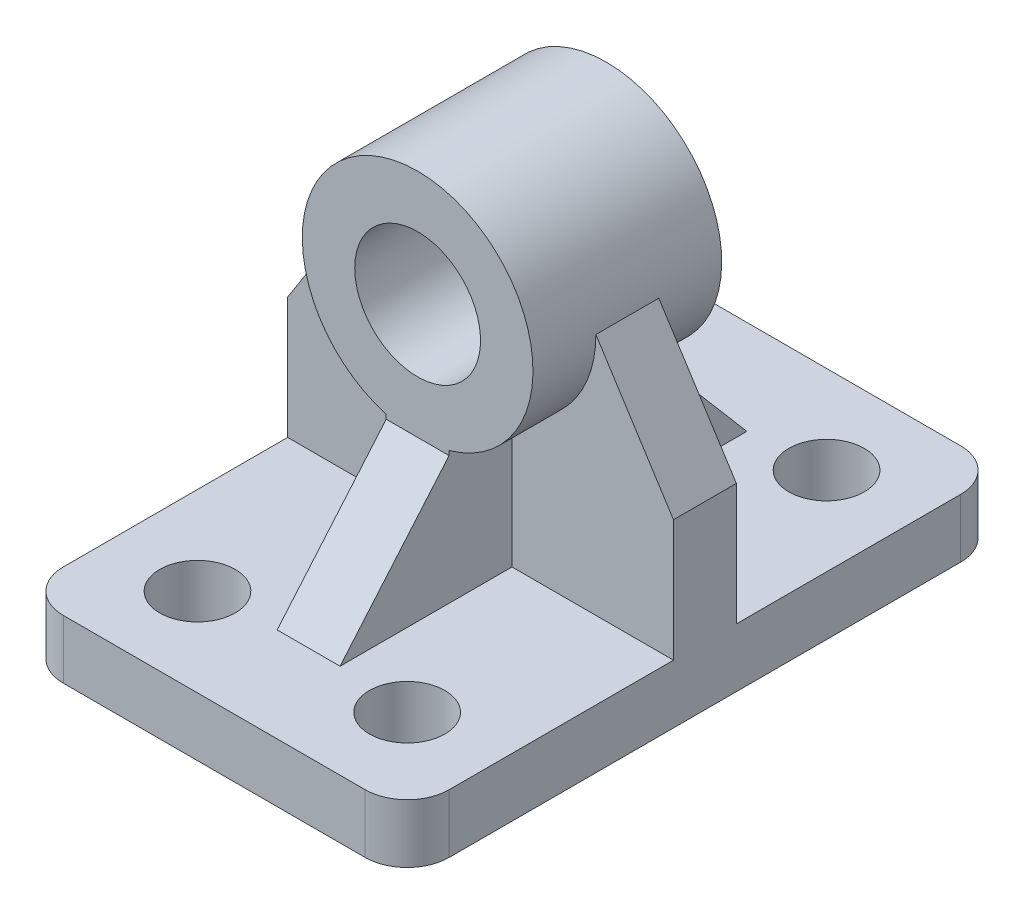
ISO-10303-21;
HEADER;
FILE_DESCRIPTION(('STEP AP214'),'2;1');
FILE_NAME('part.step','',(''),(''),'','','');
FILE_SCHEMA(('AUTOMOTIVE_DESIGN { 1 0 10303 214 1 1 1 1 }'));
ENDSEC;
DATA;
#1=APPLICATION_CONTEXT('core data for automotive mechanical design processes');
#2=APPLICATION_PROTOCOL_DEFINITION('international standard','automotive_design',2000,#1);
#3=PRODUCT_CONTEXT('',#1,'mechanical');
#4=PRODUCT('Part','Part','',(#3));
#5=PRODUCT_RELATED_PRODUCT_CATEGORY('part','',(#4));
#6=PRODUCT_DEFINITION_FORMATION('','',#4);
#7=PRODUCT_DEFINITION_CONTEXT('part definition',#1,'design');
#8=PRODUCT_DEFINITION('design','',#6,#7);
#9=PRODUCT_DEFINITION_SHAPE('','',#8);
#10=(LENGTH_UNIT() NAMED_UNIT(*) SI_UNIT(.MILLI.,.METRE.));
#11=(NAMED_UNIT(*) PLANE_ANGLE_UNIT() SI_UNIT($,.RADIAN.));
#12=(NAMED_UNIT(*) SI_UNIT($,.STERADIAN.) SOLID_ANGLE_UNIT());
#13=UNCERTAINTY_MEASURE_WITH_UNIT(LENGTH_MEASURE(1.E-05),#10,'distance_accuracy_value','');
#14=(GEOMETRIC_REPRESENTATION_CONTEXT(3) GLOBAL_UNCERTAINTY_ASSIGNED_CONTEXT((#13)) GLOBAL_UNIT_ASSIGNED_CONTEXT((#10,
#11,#12)) REPRESENTATION_CONTEXT('',''));
#15=CARTESIAN_POINT('',(0.,0.,0.));
#16=DIRECTION('',(0.,0.,1.));
#17=DIRECTION('',(1.,0.,0.));
#18=AXIS2_PLACEMENT_3D('',#15,#16,#17);
#19=CARTESIAN_POINT('',(0.,72.,-7.5));
#20=DIRECTION('',(0.,0.,1.));
#21=DIRECTION('',(1.,0.,0.));
#22=AXIS2_PLACEMENT_3D('',#19,#20,#21);
#23=PLANE('',#22);
#24=DIRECTION('',(0.,1.,0.));
#25=VECTOR('',#24,1.);
#26=CARTESIAN_POINT('',(-7.5,72.,-7.5));
#27=LINE('',#26,#25);
#28=CARTESIAN_POINT('',(-7.5,14.,-7.5));
#29=VERTEX_POINT('',#28);
#30=CARTESIAN_POINT('',(-7.5,45.5424868893541,-7.5));
#31=VERTEX_POINT('',#30);
#32=EDGE_CURVE('E227',#29,#31,#27,.T.);
#33=ORIENTED_EDGE('',*,*,#32,.F.);
#34=DIRECTION('',(1.,0.,0.));
#35=VECTOR('',#34,1.);
#36=CARTESIAN_POINT('',(-46.,14.,-7.5));
#37=LINE('',#36,#35);
#38=CARTESIAN_POINT('',(-46.,14.,-7.49999999999999));
#39=VERTEX_POINT('',#38);
#40=EDGE_CURVE('E296',#39,#29,#37,.T.);
#41=ORIENTED_EDGE('',*,*,#40,.F.);
#42=DIRECTION('',(0.,-1.,0.));
#43=VECTOR('',#42,1.);
#44=CARTESIAN_POINT('',(-46.,14.,-7.5));
#45=LINE('',#44,#43);
#46=CARTESIAN_POINT('',(-46.,43.,-7.5));
#47=VERTEX_POINT('',#46);
#48=EDGE_CURVE('E308',#47,#39,#45,.T.);
#49=ORIENTED_EDGE('',*,*,#48,.F.);
#50=DIRECTION('',(-0.537815694759539,-0.843062440433871,0.));
#51=VECTOR('',#50,1.);
#52=CARTESIAN_POINT('',(-46.,43.,-7.5));
#53=LINE('',#52,#51);
#54=CARTESIAN_POINT('',(-27.5,72.,-7.5));
#55=VERTEX_POINT('',#54);
#56=EDGE_CURVE('E306',#55,#47,#53,.T.);
#57=ORIENTED_EDGE('',*,*,#56,.F.);
#58=CARTESIAN_POINT('',(0.,72.,-7.5));
#59=DIRECTION('',(0.,0.,-1.));
#60=DIRECTION('',(1.,0.,0.));
#61=AXIS2_PLACEMENT_3D('',#58,#59,#60);
#62=CIRCLE('',#61,27.5);
#63=EDGE_CURVE('E302',#31,#55,#62,.T.);
#64=ORIENTED_EDGE('',*,*,#63,.F.);
#65=EDGE_LOOP('',(#33,#41,#49,#57,#64));
#66=FACE_BOUND('',#65,.T.);
#67=ADVANCED_FACE('F37',(#66),#23,.F.);
#68=CARTESIAN_POINT('',(0.,72.,7.5));
#69=DIRECTION('',(0.,0.,1.));
#70=DIRECTION('',(1.,0.,0.));
#71=AXIS2_PLACEMENT_3D('',#68,#69,#70);
#72=PLANE('',#71);
#73=DIRECTION('',(1.,0.,0.));
#74=VECTOR('',#73,1.);
#75=CARTESIAN_POINT('',(-46.,14.,7.5));
#76=LINE('',#75,#74);
#77=CARTESIAN_POINT('',(-46.,14.,7.49999999999999));
#78=VERTEX_POINT('',#77);
#79=CARTESIAN_POINT('',(-7.5,14.,7.5));
#80=VERTEX_POINT('',#79);
#81=EDGE_CURVE('E278',#78,#80,#76,.T.);
#82=ORIENTED_EDGE('',*,*,#81,.T.);
#83=DIRECTION('',(0.,1.,0.));
#84=VECTOR('',#83,1.);
#85=CARTESIAN_POINT('',(-7.5,72.,7.5));
#86=LINE('',#85,#84);
#87=CARTESIAN_POINT('',(-7.5,45.5424868893541,7.5));
#88=VERTEX_POINT('',#87);
#89=EDGE_CURVE('E253',#80,#88,#86,.T.);
#90=ORIENTED_EDGE('',*,*,#89,.T.);
#91=CARTESIAN_POINT('',(0.,72.,7.5));
#92=DIRECTION('',(0.,0.,-1.));
#93=DIRECTION('',(1.,0.,0.));
#94=AXIS2_PLACEMENT_3D('',#91,#92,#93);
#95=CIRCLE('',#94,27.5);
#96=CARTESIAN_POINT('',(-27.5,72.,7.5));
#97=VERTEX_POINT('',#96);
#98=EDGE_CURVE('E286',#88,#97,#95,.T.);
#99=ORIENTED_EDGE('',*,*,#98,.T.);
#100=DIRECTION('',(-0.537815694759539,-0.843062440433871,0.));
#101=VECTOR('',#100,1.);
#102=CARTESIAN_POINT('',(-46.,43.,7.5));
#103=LINE('',#102,#101);
#104=CARTESIAN_POINT('',(-46.,43.,7.5));
#105=VERTEX_POINT('',#104);
#106=EDGE_CURVE('E290',#97,#105,#103,.T.);
#107=ORIENTED_EDGE('',*,*,#106,.T.);
#108=DIRECTION('',(0.,-1.,0.));
#109=VECTOR('',#108,1.);
#110=CARTESIAN_POINT('',(-46.,14.,7.5));
#111=LINE('',#110,#109);
#112=EDGE_CURVE('E292',#105,#78,#111,.T.);
#113=ORIENTED_EDGE('',*,*,#112,.T.);
#114=EDGE_LOOP('',(#82,#90,#99,#107,#113));
#115=FACE_BOUND('',#114,.T.);
#116=ADVANCED_FACE('F450',(#115),#72,.T.);
#117=CARTESIAN_POINT('',(0.,14.,0.));
#118=DIRECTION('',(0.,-1.,0.));
#119=DIRECTION('',(0.,0.,-1.));
#120=AXIS2_PLACEMENT_3D('',#117,#118,#119);
#121=PLANE('',#120);
#122=CARTESIAN_POINT('',(25.,14.,50.));
#123=DIRECTION('',(0.,1.,0.));
#124=DIRECTION('',(0.,0.,1.));
#125=AXIS2_PLACEMENT_3D('',#122,#123,#124);
#126=CIRCLE('',#125,9.);
#127=CARTESIAN_POINT('',(25.,14.,59.));
#128=VERTEX_POINT('',#127);
#129=EDGE_CURVE('E341',#128,#128,#126,.T.);
#130=ORIENTED_EDGE('',*,*,#129,.F.);
#131=EDGE_LOOP('',(#130));
#132=FACE_BOUND('',#131,.T.);
#133=DIRECTION('',(0.,0.,1.));
#134=VECTOR('',#133,1.);
#135=CARTESIAN_POINT('',(7.5,14.,0.));
#136=LINE('',#135,#134);
#137=CARTESIAN_POINT('',(7.5,14.,7.5));
#138=VERTEX_POINT('',#137);
#139=CARTESIAN_POINT('',(7.5,14.,48.5));
#140=VERTEX_POINT('',#139);
#141=EDGE_CURVE('E264',#138,#140,#136,.T.);
#142=ORIENTED_EDGE('',*,*,#141,.T.);
#143=DIRECTION('',(1.,0.,0.));
#144=VECTOR('',#143,1.);
#145=CARTESIAN_POINT('',(0.,14.,48.5));
#146=LINE('',#145,#144);
#147=CARTESIAN_POINT('',(-7.5,14.,48.5));
#148=VERTEX_POINT('',#147);
#149=EDGE_CURVE('E266',#140,#148,#146,.F.);
#150=ORIENTED_EDGE('',*,*,#149,.T.);
#151=DIRECTION('',(0.,0.,1.));
#152=VECTOR('',#151,1.);
#153=CARTESIAN_POINT('',(-7.5,14.,0.));
#154=LINE('',#153,#152);
#155=EDGE_CURVE('E256',#80,#148,#154,.T.);
#156=ORIENTED_EDGE('',*,*,#155,.F.);
#157=ORIENTED_EDGE('',*,*,#81,.F.);
#158=DIRECTION('',(0.,0.,1.));
#159=VECTOR('',#158,1.);
#160=CARTESIAN_POINT('',(-46.,14.,71.));
#161=LINE('',#160,#159);
#162=CARTESIAN_POINT('',(-46.,14.,61.));
#163=VERTEX_POINT('',#162);
#164=EDGE_CURVE('E353',#78,#163,#161,.T.);
#165=ORIENTED_EDGE('',*,*,#164,.T.);
#166=CARTESIAN_POINT('',(-36.,14.,61.));
#167=DIRECTION('',(0.,-1.,0.));
#168=DIRECTION('',(0.,0.,-1.));
#169=AXIS2_PLACEMENT_3D('',#166,#167,#168);
#170=CIRCLE('',#169,10.);
#171=CARTESIAN_POINT('',(-36.,14.,71.));
#172=VERTEX_POINT('',#171);
#173=EDGE_CURVE('E389',#163,#172,#170,.F.);
#174=ORIENTED_EDGE('',*,*,#173,.T.);
#175=DIRECTION('',(1.,0.,0.));
#176=VECTOR('',#175,1.);
#177=CARTESIAN_POINT('',(-46.,14.,71.));
#178=LINE('',#177,#176);
#179=CARTESIAN_POINT('',(36.,14.,71.));
#180=VERTEX_POINT('',#179);
#181=EDGE_CURVE('E356',#172,#180,#178,.T.);
#182=ORIENTED_EDGE('',*,*,#181,.T.);
#183=CARTESIAN_POINT('',(36.,14.,61.));
#184=DIRECTION('',(0.,-1.,0.));
#185=DIRECTION('',(0.,0.,-1.));
#186=AXIS2_PLACEMENT_3D('',#183,#184,#185);
#187=CIRCLE('',#186,10.);
#188=CARTESIAN_POINT('',(46.,14.,61.));
#189=VERTEX_POINT('',#188);
#190=EDGE_CURVE('E391',#180,#189,#187,.F.);
#191=ORIENTED_EDGE('',*,*,#190,.T.);
#192=DIRECTION('',(0.,0.,-1.));
#193=VECTOR('',#192,1.);
#194=CARTESIAN_POINT('',(46.,14.,71.));
#195=LINE('',#194,#193);
#196=CARTESIAN_POINT('',(46.,14.,7.5));
#197=VERTEX_POINT('',#196);
#198=EDGE_CURVE('E347',#189,#197,#195,.T.);
#199=ORIENTED_EDGE('',*,*,#198,.T.);
#200=EDGE_CURVE('E282',#138,#197,#76,.T.);
#201=ORIENTED_EDGE('',*,*,#200,.F.);
#202=EDGE_LOOP('',(#142,#150,#156,#157,#165,#174,#182,#191,#199,#201));
#203=FACE_BOUND('',#202,.T.);
#204=CARTESIAN_POINT('',(-25.,14.,50.));
#205=DIRECTION('',(0.,1.,0.));
#206=DIRECTION('',(0.,0.,-1.));
#207=AXIS2_PLACEMENT_3D('',#204,#205,#206);
#208=CIRCLE('',#207,9.00000000000001);
#209=CARTESIAN_POINT('',(-25.,14.,41.));
#210=VERTEX_POINT('',#209);
#211=EDGE_CURVE('E329',#210,#210,#208,.T.);
#212=ORIENTED_EDGE('',*,*,#211,.F.);
#213=EDGE_LOOP('',(#212));
#214=FACE_BOUND('',#213,.T.);
#215=ADVANCED_FACE('F422',(#132,#203,#214),#121,.F.);
#216=DIRECTION('',(1.,0.,0.));
#217=VECTOR('',#216,1.);
#218=CARTESIAN_POINT('',(0.,14.,-48.5));
#219=LINE('',#218,#217);
#220=CARTESIAN_POINT('',(-7.5,14.,-48.5));
#221=VERTEX_POINT('',#220);
#222=CARTESIAN_POINT('',(7.5,14.,-48.5));
#223=VERTEX_POINT('',#222);
#224=EDGE_CURVE('E52',#221,#223,#219,.T.);
#225=ORIENTED_EDGE('',*,*,#224,.T.);
#226=DIRECTION('',(0.,0.,1.));
#227=VECTOR('',#226,1.);
#228=CARTESIAN_POINT('',(7.5,14.,0.));
#229=LINE('',#228,#227);
#230=CARTESIAN_POINT('',(7.5,14.,-7.5));
#231=VERTEX_POINT('',#230);
#232=EDGE_CURVE('E215',#223,#231,#229,.T.);
#233=ORIENTED_EDGE('',*,*,#232,.T.);
#234=CARTESIAN_POINT('',(46.,14.,-7.49999999999999));
#235=VERTEX_POINT('',#234);
#236=EDGE_CURVE('E276',#231,#235,#37,.T.);
#237=ORIENTED_EDGE('',*,*,#236,.T.);
#238=CARTESIAN_POINT('',(46.,14.,-61.));
#239=VERTEX_POINT('',#238);
#240=EDGE_CURVE('E351',#235,#239,#195,.T.);
#241=ORIENTED_EDGE('',*,*,#240,.T.);
#242=CARTESIAN_POINT('',(36.,14.,-61.));
#243=DIRECTION('',(0.,-1.,0.));
#244=DIRECTION('',(0.,0.,-1.));
#245=AXIS2_PLACEMENT_3D('',#242,#243,#244);
#246=CIRCLE('',#245,10.);
#247=CARTESIAN_POINT('',(36.,14.,-71.));
#248=VERTEX_POINT('',#247);
#249=EDGE_CURVE('E393',#239,#248,#246,.F.);
#250=ORIENTED_EDGE('',*,*,#249,.T.);
#251=DIRECTION('',(-1.,0.,0.));
#252=VECTOR('',#251,1.);
#253=CARTESIAN_POINT('',(-46.,14.,-71.));
#254=LINE('',#253,#252);
#255=CARTESIAN_POINT('',(-36.,14.,-71.));
#256=VERTEX_POINT('',#255);
#257=EDGE_CURVE('E350',#248,#256,#254,.T.);
#258=ORIENTED_EDGE('',*,*,#257,.T.);
#259=CARTESIAN_POINT('',(-36.,14.,-61.));
#260=DIRECTION('',(0.,-1.,0.));
#261=DIRECTION('',(0.,0.,-1.));
#262=AXIS2_PLACEMENT_3D('',#259,#260,#261);
#263=CIRCLE('',#262,10.);
#264=CARTESIAN_POINT('',(-46.,14.,-61.));
#265=VERTEX_POINT('',#264);
#266=EDGE_CURVE('E395',#256,#265,#263,.F.);
#267=ORIENTED_EDGE('',*,*,#266,.T.);
#268=EDGE_CURVE('E354',#265,#39,#161,.T.);
#269=ORIENTED_EDGE('',*,*,#268,.T.);
#270=ORIENTED_EDGE('',*,*,#40,.T.);
#271=DIRECTION('',(0.,0.,1.));
#272=VECTOR('',#271,1.);
#273=CARTESIAN_POINT('',(-7.5,14.,0.));
#274=LINE('',#273,#272);
#275=EDGE_CURVE('E57',#221,#29,#274,.T.);
#276=ORIENTED_EDGE('',*,*,#275,.F.);
#277=EDGE_LOOP('',(#225,#233,#237,#241,#250,#258,#267,#269,#270,#276));
#278=FACE_BOUND('',#277,.T.);
#279=CARTESIAN_POINT('',(25.,14.,-50.));
#280=DIRECTION('',(0.,1.,0.));
#281=DIRECTION('',(0.,0.,-1.));
#282=AXIS2_PLACEMENT_3D('',#279,#280,#281);
#283=CIRCLE('',#282,9.);
#284=CARTESIAN_POINT('',(25.,14.,-59.));
#285=VERTEX_POINT('',#284);
#286=EDGE_CURVE('E335',#285,#285,#283,.T.);
#287=ORIENTED_EDGE('',*,*,#286,.F.);
#288=EDGE_LOOP('',(#287));
#289=FACE_BOUND('',#288,.T.);
#290=CARTESIAN_POINT('',(-25.,14.,-50.));
#291=DIRECTION('',(0.,1.,0.));
#292=DIRECTION('',(0.,0.,1.));
#293=AXIS2_PLACEMENT_3D('',#290,#291,#292);
#294=CIRCLE('',#293,9.);
#295=CARTESIAN_POINT('',(-25.,14.,-41.));
#296=VERTEX_POINT('',#295);
#297=EDGE_CURVE('E323',#296,#296,#294,.T.);
#298=ORIENTED_EDGE('',*,*,#297,.F.);
#299=EDGE_LOOP('',(#298));
#300=FACE_BOUND('',#299,.T.);
#301=ADVANCED_FACE('F502',(#278,#289,#300),#121,.F.);
#302=CARTESIAN_POINT('',(0.,0.,0.));
#303=DIRECTION('',(0.,-1.,0.));
#304=DIRECTION('',(0.,0.,-1.));
#305=AXIS2_PLACEMENT_3D('',#302,#303,#304);
#306=PLANE('',#305);
#307=CARTESIAN_POINT('',(36.,0.,61.));
#308=DIRECTION('',(0.,-1.,0.));
#309=DIRECTION('',(0.,0.,-1.));
#310=AXIS2_PLACEMENT_3D('',#307,#308,#309);
#311=CIRCLE('',#310,10.);
#312=CARTESIAN_POINT('',(46.,0.,61.));
#313=VERTEX_POINT('',#312);
#314=CARTESIAN_POINT('',(36.,0.,71.));
#315=VERTEX_POINT('',#314);
#316=EDGE_CURVE('E375',#313,#315,#311,.T.);
#317=ORIENTED_EDGE('',*,*,#316,.T.);
#318=DIRECTION('',(1.,0.,0.));
#319=VECTOR('',#318,1.);
#320=CARTESIAN_POINT('',(-46.,0.,71.));
#321=LINE('',#320,#319);
#322=CARTESIAN_POINT('',(-36.,0.,71.));
#323=VERTEX_POINT('',#322);
#324=EDGE_CURVE('E366',#323,#315,#321,.T.);
#325=ORIENTED_EDGE('',*,*,#324,.F.);
#326=CARTESIAN_POINT('',(-36.,0.,61.));
#327=DIRECTION('',(0.,-1.,0.));
#328=DIRECTION('',(0.,0.,-1.));
#329=AXIS2_PLACEMENT_3D('',#326,#327,#328);
#330=CIRCLE('',#329,10.);
#331=CARTESIAN_POINT('',(-46.,0.,61.));
#332=VERTEX_POINT('',#331);
#333=EDGE_CURVE('E373',#323,#332,#330,.T.);
#334=ORIENTED_EDGE('',*,*,#333,.T.);
#335=DIRECTION('',(0.,0.,1.));
#336=VECTOR('',#335,1.);
#337=CARTESIAN_POINT('',(-46.,0.,71.));
#338=LINE('',#337,#336);
#339=CARTESIAN_POINT('',(-46.,0.,-61.));
#340=VERTEX_POINT('',#339);
#341=EDGE_CURVE('E363',#340,#332,#338,.T.);
#342=ORIENTED_EDGE('',*,*,#341,.F.);
#343=CARTESIAN_POINT('',(-36.,0.,-61.));
#344=DIRECTION('',(0.,-1.,0.));
#345=DIRECTION('',(0.,0.,-1.));
#346=AXIS2_PLACEMENT_3D('',#343,#344,#345);
#347=CIRCLE('',#346,10.);
#348=CARTESIAN_POINT('',(-36.,0.,-71.));
#349=VERTEX_POINT('',#348);
#350=EDGE_CURVE('E380',#340,#349,#347,.T.);
#351=ORIENTED_EDGE('',*,*,#350,.T.);
#352=DIRECTION('',(-1.,0.,0.));
#353=VECTOR('',#352,1.);
#354=CARTESIAN_POINT('',(-46.,0.,-71.));
#355=LINE('',#354,#353);
#356=CARTESIAN_POINT('',(36.,0.,-71.));
#357=VERTEX_POINT('',#356);
#358=EDGE_CURVE('E361',#357,#349,#355,.T.);
#359=ORIENTED_EDGE('',*,*,#358,.F.);
#360=CARTESIAN_POINT('',(36.,0.,-61.));
#361=DIRECTION('',(0.,-1.,0.));
#362=DIRECTION('',(0.,0.,-1.));
#363=AXIS2_PLACEMENT_3D('',#360,#361,#362);
#364=CIRCLE('',#363,10.);
#365=CARTESIAN_POINT('',(46.,0.,-61.));
#366=VERTEX_POINT('',#365);
#367=EDGE_CURVE('E378',#357,#366,#364,.T.);
#368=ORIENTED_EDGE('',*,*,#367,.T.);
#369=DIRECTION('',(0.,0.,-1.));
#370=VECTOR('',#369,1.);
#371=CARTESIAN_POINT('',(46.,0.,71.));
#372=LINE('',#371,#370);
#373=EDGE_CURVE('E344',#313,#366,#372,.T.);
#374=ORIENTED_EDGE('',*,*,#373,.F.);
#375=EDGE_LOOP('',(#317,#325,#334,#342,#351,#359,#368,#374));
#376=FACE_BOUND('',#375,.T.);
#377=CARTESIAN_POINT('',(-25.,0.,50.));
#378=DIRECTION('',(0.,1.,0.));
#379=DIRECTION('',(0.,0.,-1.));
#380=AXIS2_PLACEMENT_3D('',#377,#378,#379);
#381=CIRCLE('',#380,9.00000000000001);
#382=CARTESIAN_POINT('',(-25.,0.,41.));
#383=VERTEX_POINT('',#382);
#384=EDGE_CURVE('E326',#383,#383,#381,.T.);
#385=ORIENTED_EDGE('',*,*,#384,.T.);
#386=EDGE_LOOP('',(#385));
#387=FACE_BOUND('',#386,.T.);
#388=CARTESIAN_POINT('',(25.,0.,50.));
#389=DIRECTION('',(0.,1.,0.));
#390=DIRECTION('',(0.,0.,1.));
#391=AXIS2_PLACEMENT_3D('',#388,#389,#390);
#392=CIRCLE('',#391,9.);
#393=CARTESIAN_POINT('',(25.,0.,59.));
#394=VERTEX_POINT('',#393);
#395=EDGE_CURVE('E338',#394,#394,#392,.T.);
#396=ORIENTED_EDGE('',*,*,#395,.T.);
#397=EDGE_LOOP('',(#396));
#398=FACE_BOUND('',#397,.T.);
#399=CARTESIAN_POINT('',(25.,0.,-50.));
#400=DIRECTION('',(0.,1.,0.));
#401=DIRECTION('',(0.,0.,-1.));
#402=AXIS2_PLACEMENT_3D('',#399,#400,#401);
#403=CIRCLE('',#402,9.);
#404=CARTESIAN_POINT('',(25.,0.,-59.));
#405=VERTEX_POINT('',#404);
#406=EDGE_CURVE('E332',#405,#405,#403,.T.);
#407=ORIENTED_EDGE('',*,*,#406,.T.);
#408=EDGE_LOOP('',(#407));
#409=FACE_BOUND('',#408,.T.);
#410=CARTESIAN_POINT('',(-25.,0.,-50.));
#411=DIRECTION('',(0.,1.,0.));
#412=DIRECTION('',(0.,0.,1.));
#413=AXIS2_PLACEMENT_3D('',#410,#411,#412);
#414=CIRCLE('',#413,9.);
#415=CARTESIAN_POINT('',(-25.,0.,-41.));
#416=VERTEX_POINT('',#415);
#417=EDGE_CURVE('E322',#416,#416,#414,.T.);
#418=ORIENTED_EDGE('',*,*,#417,.T.);
#419=EDGE_LOOP('',(#418));
#420=FACE_BOUND('',#419,.T.);
#421=ADVANCED_FACE('F411',(#376,#387,#398,#409,#420),#306,.T.);
#422=CARTESIAN_POINT('',(46.,14.,71.));
#423=DIRECTION('',(-1.,0.,0.));
#424=DIRECTION('',(0.,0.,1.));
#425=AXIS2_PLACEMENT_3D('',#422,#423,#424);
#426=PLANE('',#425);
#427=ORIENTED_EDGE('',*,*,#373,.T.);
#428=DIRECTION('',(0.,-1.,0.));
#429=VECTOR('',#428,1.);
#430=CARTESIAN_POINT('',(46.,14.,-61.));
#431=LINE('',#430,#429);
#432=EDGE_CURVE('E400',#366,#239,#431,.F.);
#433=ORIENTED_EDGE('',*,*,#432,.T.);
#434=ORIENTED_EDGE('',*,*,#240,.F.);
#435=DIRECTION('',(0.,1.,0.));
#436=VECTOR('',#435,1.);
#437=CARTESIAN_POINT('',(46.,14.,-7.5));
#438=LINE('',#437,#436);
#439=CARTESIAN_POINT('',(46.,43.,-7.5));
#440=VERTEX_POINT('',#439);
#441=EDGE_CURVE('E298',#235,#440,#438,.T.);
#442=ORIENTED_EDGE('',*,*,#441,.T.);
#443=DIRECTION('',(0.,0.,-1.));
#444=VECTOR('',#443,1.);
#445=CARTESIAN_POINT('',(46.,43.,7.5));
#446=LINE('',#445,#444);
#447=CARTESIAN_POINT('',(46.,43.,7.5));
#448=VERTEX_POINT('',#447);
#449=EDGE_CURVE('E319',#448,#440,#446,.T.);
#450=ORIENTED_EDGE('',*,*,#449,.F.);
#451=DIRECTION('',(0.,1.,0.));
#452=VECTOR('',#451,1.);
#453=CARTESIAN_POINT('',(46.,14.,7.5));
#454=LINE('',#453,#452);
#455=EDGE_CURVE('E281',#197,#448,#454,.T.);
#456=ORIENTED_EDGE('',*,*,#455,.F.);
#457=ORIENTED_EDGE('',*,*,#198,.F.);
#458=DIRECTION('',(0.,-1.,0.));
#459=VECTOR('',#458,1.);
#460=CARTESIAN_POINT('',(46.,14.,61.));
#461=LINE('',#460,#459);
#462=EDGE_CURVE('E397',#189,#313,#461,.T.);
#463=ORIENTED_EDGE('',*,*,#462,.T.);
#464=EDGE_LOOP('',(#427,#433,#434,#442,#450,#456,#457,#463));
#465=FACE_BOUND('',#464,.T.);
#466=ADVANCED_FACE('F427',(#465),#426,.F.);
#467=CARTESIAN_POINT('',(-46.,14.,-71.));
#468=DIRECTION('',(0.,0.,1.));
#469=DIRECTION('',(1.,0.,0.));
#470=AXIS2_PLACEMENT_3D('',#467,#468,#469);
#471=PLANE('',#470);
#472=ORIENTED_EDGE('',*,*,#358,.T.);
#473=DIRECTION('',(0.,-1.,0.));
#474=VECTOR('',#473,1.);
#475=CARTESIAN_POINT('',(-36.,14.,-71.));
#476=LINE('',#475,#474);
#477=EDGE_CURVE('E386',#349,#256,#476,.F.);
#478=ORIENTED_EDGE('',*,*,#477,.T.);
#479=ORIENTED_EDGE('',*,*,#257,.F.);
#480=DIRECTION('',(0.,-1.,0.));
#481=VECTOR('',#480,1.);
#482=CARTESIAN_POINT('',(36.,14.,-71.));
#483=LINE('',#482,#481);
#484=EDGE_CURVE('E383',#248,#357,#483,.T.);
#485=ORIENTED_EDGE('',*,*,#484,.T.);
#486=EDGE_LOOP('',(#472,#478,#479,#485));
#487=FACE_BOUND('',#486,.T.);
#488=ADVANCED_FACE('F628',(#487),#471,.F.);
#489=CARTESIAN_POINT('',(-46.,14.,71.));
#490=DIRECTION('',(1.,0.,0.));
#491=DIRECTION('',(0.,0.,-1.));
#492=AXIS2_PLACEMENT_3D('',#489,#490,#491);
#493=PLANE('',#492);
#494=ORIENTED_EDGE('',*,*,#268,.F.);
#495=DIRECTION('',(0.,-1.,0.));
#496=VECTOR('',#495,1.);
#497=CARTESIAN_POINT('',(-46.,14.,-61.));
#498=LINE('',#497,#496);
#499=EDGE_CURVE('E370',#265,#340,#498,.T.);
#500=ORIENTED_EDGE('',*,*,#499,.T.);
#501=ORIENTED_EDGE('',*,*,#341,.T.);
#502=DIRECTION('',(0.,-1.,0.));
#503=VECTOR('',#502,1.);
#504=CARTESIAN_POINT('',(-46.,14.,61.));
#505=LINE('',#504,#503);
#506=EDGE_CURVE('E358',#332,#163,#505,.F.);
#507=ORIENTED_EDGE('',*,*,#506,.T.);
#508=ORIENTED_EDGE('',*,*,#164,.F.);
#509=ORIENTED_EDGE('',*,*,#112,.F.);
#510=DIRECTION('',(0.,0.,-1.));
#511=VECTOR('',#510,1.);
#512=CARTESIAN_POINT('',(-46.,43.,7.5));
#513=LINE('',#512,#511);
#514=EDGE_CURVE('E295',#105,#47,#513,.T.);
#515=ORIENTED_EDGE('',*,*,#514,.T.);
#516=ORIENTED_EDGE('',*,*,#48,.T.);
#517=EDGE_LOOP('',(#494,#500,#501,#507,#508,#509,#515,#516));
#518=FACE_BOUND('',#517,.T.);
#519=ADVANCED_FACE('F456',(#518),#493,.F.);
#520=CARTESIAN_POINT('',(-46.,14.,71.));
#521=DIRECTION('',(0.,0.,-1.));
#522=DIRECTION('',(-1.,0.,0.));
#523=AXIS2_PLACEMENT_3D('',#520,#521,#522);
#524=PLANE('',#523);
#525=DIRECTION('',(0.,-1.,0.));
#526=VECTOR('',#525,1.);
#527=CARTESIAN_POINT('',(36.,14.,71.));
#528=LINE('',#527,#526);
#529=EDGE_CURVE('E11',#315,#180,#528,.F.);
#530=ORIENTED_EDGE('',*,*,#529,.T.);
#531=ORIENTED_EDGE('',*,*,#181,.F.);
#532=DIRECTION('',(0.,-1.,0.));
#533=VECTOR('',#532,1.);
#534=CARTESIAN_POINT('',(-36.,14.,71.));
#535=LINE('',#534,#533);
#536=EDGE_CURVE('E45',#172,#323,#535,.T.);
#537=ORIENTED_EDGE('',*,*,#536,.T.);
#538=ORIENTED_EDGE('',*,*,#324,.T.);
#539=EDGE_LOOP('',(#530,#531,#537,#538));
#540=FACE_BOUND('',#539,.T.);
#541=ADVANCED_FACE('F407',(#540),#524,.F.);
#542=CARTESIAN_POINT('',(25.,14.,50.));
#543=DIRECTION('',(0.,-1.,0.));
#544=DIRECTION('',(0.,0.,-1.));
#545=AXIS2_PLACEMENT_3D('',#542,#543,#544);
#546=CYLINDRICAL_SURFACE('',#545,9.);
#547=ORIENTED_EDGE('',*,*,#129,.T.);
#548=EDGE_LOOP('',(#547));
#549=FACE_BOUND('',#548,.T.);
#550=ORIENTED_EDGE('',*,*,#395,.F.);
#551=EDGE_LOOP('',(#550));
#552=FACE_BOUND('',#551,.T.);
#553=ADVANCED_FACE('F707',(#549,#552),#546,.F.);
#554=CARTESIAN_POINT('',(25.,14.,-50.));
#555=DIRECTION('',(0.,-1.,0.));
#556=DIRECTION('',(0.,0.,-1.));
#557=AXIS2_PLACEMENT_3D('',#554,#555,#556);
#558=CYLINDRICAL_SURFACE('',#557,9.);
#559=ORIENTED_EDGE('',*,*,#286,.T.);
#560=EDGE_LOOP('',(#559));
#561=FACE_BOUND('',#560,.T.);
#562=ORIENTED_EDGE('',*,*,#406,.F.);
#563=EDGE_LOOP('',(#562));
#564=FACE_BOUND('',#563,.T.);
#565=ADVANCED_FACE('F697',(#561,#564),#558,.F.);
#566=CARTESIAN_POINT('',(-25.,14.,50.));
#567=DIRECTION('',(0.,-1.,0.));
#568=DIRECTION('',(0.,0.,-1.));
#569=AXIS2_PLACEMENT_3D('',#566,#567,#568);
#570=CYLINDRICAL_SURFACE('',#569,9.00000000000001);
#571=ORIENTED_EDGE('',*,*,#211,.T.);
#572=EDGE_LOOP('',(#571));
#573=FACE_BOUND('',#572,.T.);
#574=ORIENTED_EDGE('',*,*,#384,.F.);
#575=EDGE_LOOP('',(#574));
#576=FACE_BOUND('',#575,.T.);
#577=ADVANCED_FACE('F687',(#573,#576),#570,.F.);
#578=CARTESIAN_POINT('',(-25.,14.,-50.));
#579=DIRECTION('',(0.,-1.,0.));
#580=DIRECTION('',(0.,0.,-1.));
#581=AXIS2_PLACEMENT_3D('',#578,#579,#580);
#582=CYLINDRICAL_SURFACE('',#581,9.);
#583=ORIENTED_EDGE('',*,*,#297,.T.);
#584=EDGE_LOOP('',(#583));
#585=FACE_BOUND('',#584,.T.);
#586=ORIENTED_EDGE('',*,*,#417,.F.);
#587=EDGE_LOOP('',(#586));
#588=FACE_BOUND('',#587,.T.);
#589=ADVANCED_FACE('F677',(#585,#588),#582,.F.);
#590=CARTESIAN_POINT('',(-36.,14.,-61.));
#591=DIRECTION('',(0.,-1.,0.));
#592=DIRECTION('',(0.,0.,-1.));
#593=AXIS2_PLACEMENT_3D('',#590,#591,#592);
#594=CYLINDRICAL_SURFACE('',#593,10.);
#595=ORIENTED_EDGE('',*,*,#266,.F.);
#596=ORIENTED_EDGE('',*,*,#477,.F.);
#597=ORIENTED_EDGE('',*,*,#350,.F.);
#598=ORIENTED_EDGE('',*,*,#499,.F.);
#599=EDGE_LOOP('',(#595,#596,#597,#598));
#600=FACE_BOUND('',#599,.T.);
#601=ADVANCED_FACE('F667',(#600),#594,.T.);
#602=CARTESIAN_POINT('',(36.,14.,-61.));
#603=DIRECTION('',(0.,-1.,0.));
#604=DIRECTION('',(0.,0.,-1.));
#605=AXIS2_PLACEMENT_3D('',#602,#603,#604);
#606=CYLINDRICAL_SURFACE('',#605,10.);
#607=ORIENTED_EDGE('',*,*,#249,.F.);
#608=ORIENTED_EDGE('',*,*,#432,.F.);
#609=ORIENTED_EDGE('',*,*,#367,.F.);
#610=ORIENTED_EDGE('',*,*,#484,.F.);
#611=EDGE_LOOP('',(#607,#608,#609,#610));
#612=FACE_BOUND('',#611,.T.);
#613=ADVANCED_FACE('F467',(#612),#606,.T.);
#614=CARTESIAN_POINT('',(36.,14.,61.));
#615=DIRECTION('',(0.,-1.,0.));
#616=DIRECTION('',(0.,0.,-1.));
#617=AXIS2_PLACEMENT_3D('',#614,#615,#616);
#618=CYLINDRICAL_SURFACE('',#617,10.);
#619=ORIENTED_EDGE('',*,*,#190,.F.);
#620=ORIENTED_EDGE('',*,*,#529,.F.);
#621=ORIENTED_EDGE('',*,*,#316,.F.);
#622=ORIENTED_EDGE('',*,*,#462,.F.);
#623=EDGE_LOOP('',(#619,#620,#621,#622));
#624=FACE_BOUND('',#623,.T.);
#625=ADVANCED_FACE('F419',(#624),#618,.T.);
#626=CARTESIAN_POINT('',(-36.,14.,61.));
#627=DIRECTION('',(0.,-1.,0.));
#628=DIRECTION('',(0.,0.,-1.));
#629=AXIS2_PLACEMENT_3D('',#626,#627,#628);
#630=CYLINDRICAL_SURFACE('',#629,10.);
#631=ORIENTED_EDGE('',*,*,#173,.F.);
#632=ORIENTED_EDGE('',*,*,#506,.F.);
#633=ORIENTED_EDGE('',*,*,#333,.F.);
#634=ORIENTED_EDGE('',*,*,#536,.F.);
#635=EDGE_LOOP('',(#631,#632,#633,#634));
#636=FACE_BOUND('',#635,.T.);
#637=ADVANCED_FACE('F39',(#636),#630,.T.);
#638=CARTESIAN_POINT('',(46.,43.,7.5));
#639=DIRECTION('',(-0.843062440433871,-0.537815694759539,0.));
#640=DIRECTION('',(0.537815694759539,-0.843062440433871,0.));
#641=AXIS2_PLACEMENT_3D('',#638,#639,#640);
#642=PLANE('',#641);
#643=DIRECTION('',(-0.537815694759539,0.843062440433871,0.));
#644=VECTOR('',#643,1.);
#645=CARTESIAN_POINT('',(46.,43.,-7.5));
#646=LINE('',#645,#644);
#647=CARTESIAN_POINT('',(27.5,72.,-7.5));
#648=VERTEX_POINT('',#647);
#649=EDGE_CURVE('E300',#440,#648,#646,.T.);
#650=ORIENTED_EDGE('',*,*,#649,.T.);
#651=DIRECTION('',(0.,0.,-1.));
#652=VECTOR('',#651,1.);
#653=CARTESIAN_POINT('',(27.5,72.,7.5));
#654=LINE('',#653,#652);
#655=CARTESIAN_POINT('',(27.5,72.,7.5));
#656=VERTEX_POINT('',#655);
#657=EDGE_CURVE('E316',#656,#648,#654,.T.);
#658=ORIENTED_EDGE('',*,*,#657,.F.);
#659=DIRECTION('',(-0.537815694759539,0.843062440433871,0.));
#660=VECTOR('',#659,1.);
#661=CARTESIAN_POINT('',(46.,43.,7.5));
#662=LINE('',#661,#660);
#663=EDGE_CURVE('E284',#448,#656,#662,.T.);
#664=ORIENTED_EDGE('',*,*,#663,.F.);
#665=ORIENTED_EDGE('',*,*,#449,.T.);
#666=EDGE_LOOP('',(#650,#658,#664,#665));
#667=FACE_BOUND('',#666,.T.);
#668=ADVANCED_FACE('F459',(#667),#642,.F.);
#669=CARTESIAN_POINT('',(-46.,43.,7.5));
#670=DIRECTION('',(0.843062440433871,-0.537815694759539,0.));
#671=DIRECTION('',(0.537815694759539,0.843062440433871,0.));
#672=AXIS2_PLACEMENT_3D('',#669,#670,#671);
#673=PLANE('',#672);
#674=ORIENTED_EDGE('',*,*,#56,.T.);
#675=ORIENTED_EDGE('',*,*,#514,.F.);
#676=ORIENTED_EDGE('',*,*,#106,.F.);
#677=DIRECTION('',(0.,0.,-1.));
#678=VECTOR('',#677,1.);
#679=CARTESIAN_POINT('',(-27.5,72.,7.5));
#680=LINE('',#679,#678);
#681=EDGE_CURVE('E313',#97,#55,#680,.T.);
#682=ORIENTED_EDGE('',*,*,#681,.T.);
#683=EDGE_LOOP('',(#674,#675,#676,#682));
#684=FACE_BOUND('',#683,.T.);
#685=ADVANCED_FACE('F464',(#684),#673,.F.);
#686=DIRECTION('',(0.,1.,0.));
#687=VECTOR('',#686,1.);
#688=CARTESIAN_POINT('',(7.5,72.,7.5));
#689=LINE('',#688,#687);
#690=CARTESIAN_POINT('',(7.5,45.5424868893541,7.5));
#691=VERTEX_POINT('',#690);
#692=EDGE_CURVE('E261',#138,#691,#689,.T.);
#693=ORIENTED_EDGE('',*,*,#692,.F.);
#694=ORIENTED_EDGE('',*,*,#200,.T.);
#695=ORIENTED_EDGE('',*,*,#455,.T.);
#696=ORIENTED_EDGE('',*,*,#663,.T.);
#697=EDGE_CURVE('E287',#656,#691,#95,.T.);
#698=ORIENTED_EDGE('',*,*,#697,.T.);
#699=EDGE_LOOP('',(#693,#694,#695,#696,#698));
#700=FACE_BOUND('',#699,.T.);
#701=ADVANCED_FACE('F431',(#700),#72,.T.);
#702=ORIENTED_EDGE('',*,*,#236,.F.);
#703=DIRECTION('',(0.,1.,0.));
#704=VECTOR('',#703,1.);
#705=CARTESIAN_POINT('',(7.5,72.,-7.5));
#706=LINE('',#705,#704);
#707=CARTESIAN_POINT('',(7.5,45.5424868893541,-7.5));
#708=VERTEX_POINT('',#707);
#709=EDGE_CURVE('E233',#231,#708,#706,.T.);
#710=ORIENTED_EDGE('',*,*,#709,.T.);
#711=EDGE_CURVE('E303',#648,#708,#62,.T.);
#712=ORIENTED_EDGE('',*,*,#711,.F.);
#713=ORIENTED_EDGE('',*,*,#649,.F.);
#714=ORIENTED_EDGE('',*,*,#441,.F.);
#715=EDGE_LOOP('',(#702,#710,#712,#713,#714));
#716=FACE_BOUND('',#715,.T.);
#717=ADVANCED_FACE('F471',(#716),#23,.F.);
#718=CARTESIAN_POINT('',(0.,72.,22.5));
#719=DIRECTION('',(0.,0.,1.));
#720=DIRECTION('',(1.,0.,0.));
#721=AXIS2_PLACEMENT_3D('',#718,#719,#720);
#722=PLANE('',#721);
#723=CARTESIAN_POINT('',(0.,72.,22.5));
#724=DIRECTION('',(0.,0.,1.));
#725=DIRECTION('',(1.,0.,0.));
#726=AXIS2_PLACEMENT_3D('',#723,#724,#725);
#727=CIRCLE('',#726,15.);
#728=CARTESIAN_POINT('',(-15.,72.,22.5));
#729=VERTEX_POINT('',#728);
#730=EDGE_CURVE('E269',#729,#729,#727,.T.);
#731=ORIENTED_EDGE('',*,*,#730,.F.);
#732=EDGE_LOOP('',(#731));
#733=FACE_BOUND('',#732,.T.);
#734=DIRECTION('',(0.,1.,0.));
#735=VECTOR('',#734,1.);
#736=CARTESIAN_POINT('',(7.5,49.75,22.5));
#737=LINE('',#736,#735);
#738=CARTESIAN_POINT('',(7.5,44.5,22.5));
#739=VERTEX_POINT('',#738);
#740=CARTESIAN_POINT('',(7.5,45.5424868893541,22.5));
#741=VERTEX_POINT('',#740);
#742=EDGE_CURVE('E242',#739,#741,#737,.T.);
#743=ORIENTED_EDGE('',*,*,#742,.T.);
#744=CARTESIAN_POINT('',(0.,72.,22.5));
#745=DIRECTION('',(0.,0.,1.));
#746=DIRECTION('',(1.,0.,0.));
#747=AXIS2_PLACEMENT_3D('',#744,#745,#746);
#748=CIRCLE('',#747,27.5);
#749=CARTESIAN_POINT('',(-7.5,45.5424868893541,22.5));
#750=VERTEX_POINT('',#749);
#751=EDGE_CURVE('E274',#741,#750,#748,.T.);
#752=ORIENTED_EDGE('',*,*,#751,.T.);
#753=DIRECTION('',(0.,1.,0.));
#754=VECTOR('',#753,1.);
#755=CARTESIAN_POINT('',(-7.5,49.75,22.5));
#756=LINE('',#755,#754);
#757=CARTESIAN_POINT('',(-7.5,44.5,22.5));
#758=VERTEX_POINT('',#757);
#759=EDGE_CURVE('E237',#758,#750,#756,.T.);
#760=ORIENTED_EDGE('',*,*,#759,.F.);
#761=DIRECTION('',(1.,0.,0.));
#762=VECTOR('',#761,1.);
#763=CARTESIAN_POINT('',(0.,44.5,22.5));
#764=LINE('',#763,#762);
#765=EDGE_CURVE('E241',#758,#739,#764,.T.);
#766=ORIENTED_EDGE('',*,*,#765,.T.);
#767=EDGE_LOOP('',(#743,#752,#760,#766));
#768=FACE_BOUND('',#767,.T.);
#769=ADVANCED_FACE('F478',(#733,#768),#722,.T.);
#770=CARTESIAN_POINT('',(0.,72.,-22.5));
#771=DIRECTION('',(0.,0.,1.));
#772=DIRECTION('',(1.,0.,0.));
#773=AXIS2_PLACEMENT_3D('',#770,#771,#772);
#774=PLANE('',#773);
#775=CARTESIAN_POINT('',(0.,72.,-22.5));
#776=DIRECTION('',(0.,0.,1.));
#777=DIRECTION('',(1.,0.,0.));
#778=AXIS2_PLACEMENT_3D('',#775,#776,#777);
#779=CIRCLE('',#778,15.);
#780=CARTESIAN_POINT('',(-15.,72.,-22.5));
#781=VERTEX_POINT('',#780);
#782=EDGE_CURVE('E268',#781,#781,#779,.T.);
#783=ORIENTED_EDGE('',*,*,#782,.T.);
#784=EDGE_LOOP('',(#783));
#785=FACE_BOUND('',#784,.T.);
#786=CARTESIAN_POINT('',(0.,72.,-22.5));
#787=DIRECTION('',(0.,0.,1.));
#788=DIRECTION('',(1.,0.,0.));
#789=AXIS2_PLACEMENT_3D('',#786,#787,#788);
#790=CIRCLE('',#789,27.5);
#791=CARTESIAN_POINT('',(7.5,45.5424868893541,-22.5));
#792=VERTEX_POINT('',#791);
#793=CARTESIAN_POINT('',(-7.5,45.5424868893541,-22.5));
#794=VERTEX_POINT('',#793);
#795=EDGE_CURVE('E218',#792,#794,#790,.T.);
#796=ORIENTED_EDGE('',*,*,#795,.F.);
#797=DIRECTION('',(0.,1.,0.));
#798=VECTOR('',#797,1.);
#799=CARTESIAN_POINT('',(7.5,49.75,-22.5));
#800=LINE('',#799,#798);
#801=CARTESIAN_POINT('',(7.5,44.5,-22.5));
#802=VERTEX_POINT('',#801);
#803=EDGE_CURVE('E213',#802,#792,#800,.T.);
#804=ORIENTED_EDGE('',*,*,#803,.F.);
#805=DIRECTION('',(1.,0.,0.));
#806=VECTOR('',#805,1.);
#807=CARTESIAN_POINT('',(0.,44.5,-22.5));
#808=LINE('',#807,#806);
#809=CARTESIAN_POINT('',(-7.5,44.5,-22.5));
#810=VERTEX_POINT('',#809);
#811=EDGE_CURVE('E197',#810,#802,#808,.T.);
#812=ORIENTED_EDGE('',*,*,#811,.F.);
#813=DIRECTION('',(0.,1.,0.));
#814=VECTOR('',#813,1.);
#815=CARTESIAN_POINT('',(-7.5,49.75,-22.5));
#816=LINE('',#815,#814);
#817=EDGE_CURVE('E221',#810,#794,#816,.T.);
#818=ORIENTED_EDGE('',*,*,#817,.T.);
#819=EDGE_LOOP('',(#796,#804,#812,#818));
#820=FACE_BOUND('',#819,.T.);
#821=ADVANCED_FACE('F217',(#785,#820),#774,.F.);
#822=CARTESIAN_POINT('',(0.,72.,22.5));
#823=DIRECTION('',(0.,0.,-1.));
#824=DIRECTION('',(-1.,0.,0.));
#825=AXIS2_PLACEMENT_3D('',#822,#823,#824);
#826=CYLINDRICAL_SURFACE('',#825,27.5);
#827=ORIENTED_EDGE('',*,*,#711,.T.);
#828=DIRECTION('',(0.,0.,-1.));
#829=VECTOR('',#828,1.);
#830=CARTESIAN_POINT('',(7.5,45.5424868893541,22.5));
#831=LINE('',#830,#829);
#832=EDGE_CURVE('E231',#708,#792,#831,.T.);
#833=ORIENTED_EDGE('',*,*,#832,.T.);
#834=ORIENTED_EDGE('',*,*,#795,.T.);
#835=DIRECTION('',(0.,0.,-1.));
#836=VECTOR('',#835,1.);
#837=CARTESIAN_POINT('',(-7.5,45.5424868893541,22.5));
#838=LINE('',#837,#836);
#839=EDGE_CURVE('E207',#31,#794,#838,.T.);
#840=ORIENTED_EDGE('',*,*,#839,.F.);
#841=ORIENTED_EDGE('',*,*,#63,.T.);
#842=ORIENTED_EDGE('',*,*,#681,.F.);
#843=ORIENTED_EDGE('',*,*,#98,.F.);
#844=DIRECTION('',(0.,0.,-1.));
#845=VECTOR('',#844,1.);
#846=CARTESIAN_POINT('',(-7.5,45.5424868893541,22.5));
#847=LINE('',#846,#845);
#848=EDGE_CURVE('E250',#750,#88,#847,.T.);
#849=ORIENTED_EDGE('',*,*,#848,.F.);
#850=ORIENTED_EDGE('',*,*,#751,.F.);
#851=DIRECTION('',(0.,0.,-1.));
#852=VECTOR('',#851,1.);
#853=CARTESIAN_POINT('',(7.5,45.5424868893541,22.5));
#854=LINE('',#853,#852);
#855=EDGE_CURVE('E259',#741,#691,#854,.T.);
#856=ORIENTED_EDGE('',*,*,#855,.T.);
#857=ORIENTED_EDGE('',*,*,#697,.F.);
#858=ORIENTED_EDGE('',*,*,#657,.T.);
#859=EDGE_LOOP('',(#827,#833,#834,#840,#841,#842,#843,#849,#850,#856,#857,#858));
#860=FACE_BOUND('',#859,.T.);
#861=ADVANCED_FACE('F492',(#860),#826,.T.);
#862=CARTESIAN_POINT('',(0.,72.,22.5));
#863=DIRECTION('',(0.,0.,-1.));
#864=DIRECTION('',(-1.,0.,0.));
#865=AXIS2_PLACEMENT_3D('',#862,#863,#864);
#866=CYLINDRICAL_SURFACE('',#865,15.);
#867=CARTESIAN_POINT('',(-15.,72.,-22.5));
#868=CARTESIAN_POINT('',(-15.,72.,-22.03125));
#869=CARTESIAN_POINT('',(-15.,72.,-21.5625));
#870=CARTESIAN_POINT('',(-15.,72.,-20.625));
#871=CARTESIAN_POINT('',(-15.,72.,-20.15625));
#872=CARTESIAN_POINT('',(-15.,72.,-19.21875));
#873=CARTESIAN_POINT('',(-15.,72.,-18.75));
#874=CARTESIAN_POINT('',(-15.,72.,-17.8125));
#875=CARTESIAN_POINT('',(-15.,72.,-17.34375));
#876=CARTESIAN_POINT('',(-15.,72.,-16.40625));
#877=CARTESIAN_POINT('',(-15.,72.,-15.9375));
#878=CARTESIAN_POINT('',(-15.,72.,-15.));
#879=CARTESIAN_POINT('',(-15.,72.,-14.53125));
#880=CARTESIAN_POINT('',(-15.,72.,-13.59375));
#881=CARTESIAN_POINT('',(-15.,72.,-13.125));
#882=CARTESIAN_POINT('',(-15.,72.,-12.1875));
#883=CARTESIAN_POINT('',(-15.,72.,-11.71875));
#884=CARTESIAN_POINT('',(-15.,72.,-10.78125));
#885=CARTESIAN_POINT('',(-15.,72.,-10.3125));
#886=CARTESIAN_POINT('',(-15.,72.,-9.375));
#887=CARTESIAN_POINT('',(-15.,72.,-8.90625));
#888=CARTESIAN_POINT('',(-15.,72.,-7.96875000000001));
#889=CARTESIAN_POINT('',(-15.,72.,-7.50000000000001));
#890=CARTESIAN_POINT('',(-15.,72.,-6.56250000000001));
#891=CARTESIAN_POINT('',(-15.,72.,-6.09375000000001));
#892=CARTESIAN_POINT('',(-15.,72.,-5.15625));
#893=CARTESIAN_POINT('',(-15.,72.,-4.6875));
#894=CARTESIAN_POINT('',(-15.,72.,-3.75));
#895=CARTESIAN_POINT('',(-15.,72.,-3.28125));
#896=CARTESIAN_POINT('',(-15.,72.,-2.34375000000001));
#897=CARTESIAN_POINT('',(-15.,72.,-1.87500000000001));
#898=CARTESIAN_POINT('',(-15.,72.,-0.937500000000004));
#899=CARTESIAN_POINT('',(-15.,72.,-0.468750000000004));
#900=CARTESIAN_POINT('',(-15.,72.,0.468749999999997));
#901=CARTESIAN_POINT('',(-15.,72.,0.937499999999997));
#902=CARTESIAN_POINT('',(-15.,72.,1.875));
#903=CARTESIAN_POINT('',(-15.,72.,2.34375));
#904=CARTESIAN_POINT('',(-15.,72.,3.28125));
#905=CARTESIAN_POINT('',(-15.,72.,3.75));
#906=CARTESIAN_POINT('',(-15.,72.,4.6875));
#907=CARTESIAN_POINT('',(-15.,72.,5.15625));
#908=CARTESIAN_POINT('',(-15.,72.,6.09375));
#909=CARTESIAN_POINT('',(-15.,72.,6.5625));
#910=CARTESIAN_POINT('',(-15.,72.,7.5));
#911=CARTESIAN_POINT('',(-15.,72.,7.96875));
#912=CARTESIAN_POINT('',(-15.,72.,8.90625));
#913=CARTESIAN_POINT('',(-15.,72.,9.375));
#914=CARTESIAN_POINT('',(-15.,72.,10.3125));
#915=CARTESIAN_POINT('',(-15.,72.,10.78125));
#916=CARTESIAN_POINT('',(-15.,72.,11.71875));
#917=CARTESIAN_POINT('',(-15.,72.,12.1875));
#918=CARTESIAN_POINT('',(-15.,72.,13.125));
#919=CARTESIAN_POINT('',(-15.,72.,13.59375));
#920=CARTESIAN_POINT('',(-15.,72.,14.53125));
#921=CARTESIAN_POINT('',(-15.,72.,15.));
#922=CARTESIAN_POINT('',(-15.,72.,15.9375));
#923=CARTESIAN_POINT('',(-15.,72.,16.40625));
#924=CARTESIAN_POINT('',(-15.,72.,17.34375));
#925=CARTESIAN_POINT('',(-15.,72.,17.8125));
#926=CARTESIAN_POINT('',(-15.,72.,18.75));
#927=CARTESIAN_POINT('',(-15.,72.,19.21875));
#928=CARTESIAN_POINT('',(-15.,72.,20.15625));
#929=CARTESIAN_POINT('',(-15.,72.,20.625));
#930=CARTESIAN_POINT('',(-15.,72.,21.5625));
#931=CARTESIAN_POINT('',(-15.,72.,22.03125));
#932=CARTESIAN_POINT('',(-15.,72.,22.5));
#933=B_SPLINE_CURVE_WITH_KNOTS('',3,(#867,#868,#869,#870,#871,#872,#873,#874,#875,#876,#877,
#878,#879,#880,#881,#882,#883,#884,#885,#886,#887,#888,#889,#890,#891,#892,#893,#894,#895,#896,
#897,#898,#899,#900,#901,#902,#903,#904,#905,#906,#907,#908,#909,#910,#911,#912,#913,#914,#915,
#916,#917,#918,#919,#920,#921,#922,#923,#924,#925,#926,#927,#928,#929,#930,#931,#932),
.UNSPECIFIED.,.F.,.F.,(4,2,2,2,2,2,2,2,2,2,2,2,2,2,2,2,2,2,2,2,2,2,2,2,2,2,2,2,2,2,2,2,4),(0.,
1.40625,2.8125,4.21875,5.62500000000001,7.03125,8.4375,9.84375,11.25,12.65625,14.0625,15.46875,
16.875,18.28125,19.6875,21.09375,22.5,23.90625,25.3125,26.71875,28.125,29.53125,30.9375,
32.34375,33.75,35.15625,36.5625,37.96875,39.375,40.78125,42.1875,43.59375,45.),.UNSPECIFIED.);
#934=EDGE_CURVE('BSEAM521',#781,#729,#933,.T.);
#935=ORIENTED_EDGE('',*,*,#782,.F.);
#936=ORIENTED_EDGE('',*,*,#730,.T.);
#937=ORIENTED_EDGE('',*,*,#934,.T.);
#938=ORIENTED_EDGE('',*,*,#934,.F.);
#939=EDGE_LOOP('',(#935,#937,#936,#938));
#940=FACE_BOUND('',#939,.T.);
#941=ADVANCED_FACE('F521',(#940),#866,.F.);
#942=CARTESIAN_POINT('',(0.,44.5,22.5));
#943=DIRECTION('',(0.,-0.648734176013878,-0.761015091093203));
#944=DIRECTION('',(0.,0.761015091093203,-0.648734176013877));
#945=AXIS2_PLACEMENT_3D('',#942,#943,#944);
#946=PLANE('',#945);
#947=ORIENTED_EDGE('',*,*,#149,.F.);
#948=DIRECTION('',(0.,0.761015091093203,-0.648734176013877));
#949=VECTOR('',#948,1.);
#950=CARTESIAN_POINT('',(7.5,44.5,22.5));
#951=LINE('',#950,#949);
#952=EDGE_CURVE('E238',#140,#739,#951,.T.);
#953=ORIENTED_EDGE('',*,*,#952,.T.);
#954=ORIENTED_EDGE('',*,*,#765,.F.);
#955=DIRECTION('',(0.,0.761015091093203,-0.648734176013877));
#956=VECTOR('',#955,1.);
#957=CARTESIAN_POINT('',(-7.5,44.5,22.5));
#958=LINE('',#957,#956);
#959=EDGE_CURVE('E245',#148,#758,#958,.T.);
#960=ORIENTED_EDGE('',*,*,#959,.F.);
#961=EDGE_LOOP('',(#947,#953,#954,#960));
#962=FACE_BOUND('',#961,.T.);
#963=ADVANCED_FACE('F442',(#962),#946,.F.);
#964=CARTESIAN_POINT('',(7.5,49.75,0.));
#965=DIRECTION('',(1.,0.,0.));
#966=DIRECTION('',(0.,0.,-1.));
#967=AXIS2_PLACEMENT_3D('',#964,#965,#966);
#968=PLANE('',#967);
#969=ORIENTED_EDGE('',*,*,#141,.F.);
#970=ORIENTED_EDGE('',*,*,#692,.T.);
#971=ORIENTED_EDGE('',*,*,#855,.F.);
#972=ORIENTED_EDGE('',*,*,#742,.F.);
#973=ORIENTED_EDGE('',*,*,#952,.F.);
#974=EDGE_LOOP('',(#969,#970,#971,#972,#973));
#975=FACE_BOUND('',#974,.T.);
#976=ADVANCED_FACE('F437',(#975),#968,.T.);
#977=CARTESIAN_POINT('',(-7.5,49.75,0.));
#978=DIRECTION('',(1.,0.,0.));
#979=DIRECTION('',(0.,0.,-1.));
#980=AXIS2_PLACEMENT_3D('',#977,#978,#979);
#981=PLANE('',#980);
#982=ORIENTED_EDGE('',*,*,#89,.F.);
#983=ORIENTED_EDGE('',*,*,#155,.T.);
#984=ORIENTED_EDGE('',*,*,#959,.T.);
#985=ORIENTED_EDGE('',*,*,#759,.T.);
#986=ORIENTED_EDGE('',*,*,#848,.T.);
#987=EDGE_LOOP('',(#982,#983,#984,#985,#986));
#988=FACE_BOUND('',#987,.T.);
#989=ADVANCED_FACE('F447',(#988),#981,.F.);
#990=CARTESIAN_POINT('',(0.,44.5,-22.5));
#991=DIRECTION('',(0.,0.648734176013878,-0.761015091093203));
#992=DIRECTION('',(0.,0.761015091093203,0.648734176013877));
#993=AXIS2_PLACEMENT_3D('',#990,#991,#992);
#994=PLANE('',#993);
#995=ORIENTED_EDGE('',*,*,#224,.F.);
#996=DIRECTION('',(0.,0.761015091093203,0.648734176013877));
#997=VECTOR('',#996,1.);
#998=CARTESIAN_POINT('',(-7.5,44.5,-22.5));
#999=LINE('',#998,#997);
#1000=EDGE_CURVE('E202',#221,#810,#999,.T.);
#1001=ORIENTED_EDGE('',*,*,#1000,.T.);
#1002=ORIENTED_EDGE('',*,*,#811,.T.);
#1003=DIRECTION('',(0.,0.761015091093203,0.648734176013877));
#1004=VECTOR('',#1003,1.);
#1005=CARTESIAN_POINT('',(7.5,44.5,-22.5));
#1006=LINE('',#1005,#1004);
#1007=EDGE_CURVE('E200',#223,#802,#1006,.T.);
#1008=ORIENTED_EDGE('',*,*,#1007,.F.);
#1009=EDGE_LOOP('',(#995,#1001,#1002,#1008));
#1010=FACE_BOUND('',#1009,.T.);
#1011=ADVANCED_FACE('F199',(#1010),#994,.T.);
#1012=CARTESIAN_POINT('',(7.5,49.75,0.));
#1013=DIRECTION('',(1.,0.,0.));
#1014=DIRECTION('',(0.,0.,-1.));
#1015=AXIS2_PLACEMENT_3D('',#1012,#1013,#1014);
#1016=PLANE('',#1015);
#1017=ORIENTED_EDGE('',*,*,#232,.F.);
#1018=ORIENTED_EDGE('',*,*,#1007,.T.);
#1019=ORIENTED_EDGE('',*,*,#803,.T.);
#1020=ORIENTED_EDGE('',*,*,#832,.F.);
#1021=ORIENTED_EDGE('',*,*,#709,.F.);
#1022=EDGE_LOOP('',(#1017,#1018,#1019,#1020,#1021));
#1023=FACE_BOUND('',#1022,.T.);
#1024=ADVANCED_FACE('F211',(#1023),#1016,.T.);
#1025=CARTESIAN_POINT('',(-7.5,49.75,0.));
#1026=DIRECTION('',(1.,0.,0.));
#1027=DIRECTION('',(0.,0.,-1.));
#1028=AXIS2_PLACEMENT_3D('',#1025,#1026,#1027);
#1029=PLANE('',#1028);
#1030=ORIENTED_EDGE('',*,*,#1000,.F.);
#1031=ORIENTED_EDGE('',*,*,#275,.T.);
#1032=ORIENTED_EDGE('',*,*,#32,.T.);
#1033=ORIENTED_EDGE('',*,*,#839,.T.);
#1034=ORIENTED_EDGE('',*,*,#817,.F.);
#1035=EDGE_LOOP('',(#1030,#1031,#1032,#1033,#1034));
#1036=FACE_BOUND('',#1035,.T.);
#1037=ADVANCED_FACE('F505',(#1036),#1029,.F.);
#1038=CLOSED_SHELL('',(#67,#116,#215,#301,#421,#466,#488,#519,#541,#553,#565,#577,#589,#601,
#613,#625,#637,#668,#685,#701,#717,#769,#821,#861,#941,#963,#976,#989,#1011,#1024,#1037));
#1039=MANIFOLD_SOLID_BREP('B2',#1038);
#1040=ADVANCED_BREP_SHAPE_REPRESENTATION('',(#18,#1039),#14);
#1041=SHAPE_DEFINITION_REPRESENTATION(#9,#1040);
ENDSEC;
END-ISO-10303-21;
